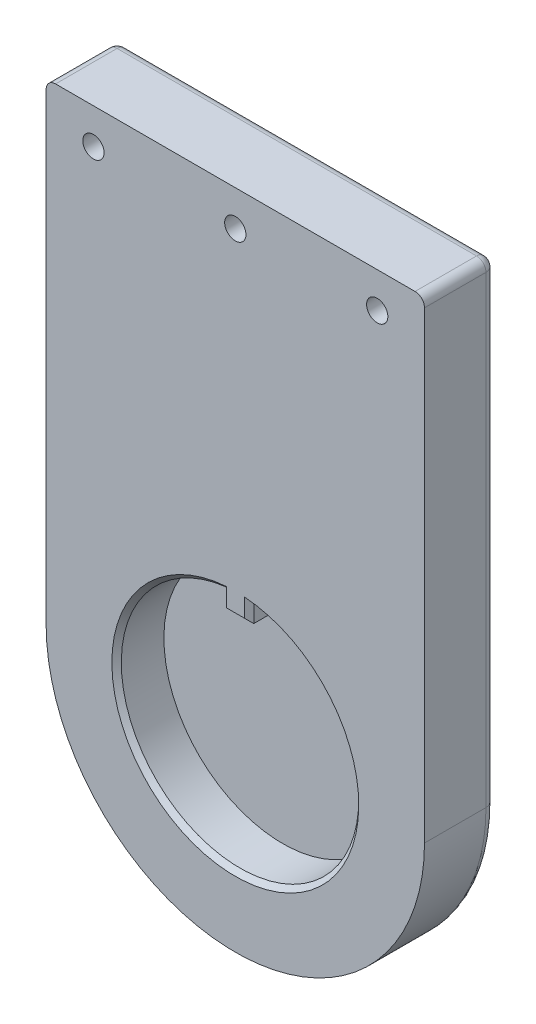
ISO-10303-21;
HEADER;
FILE_DESCRIPTION(('STEP AP214'),'2;1');
FILE_NAME('part.step','',(''),(''),'','','');
FILE_SCHEMA(('AUTOMOTIVE_DESIGN { 1 0 10303 214 1 1 1 1 }'));
ENDSEC;
DATA;
#1=APPLICATION_CONTEXT('core data for automotive mechanical design processes');
#2=APPLICATION_PROTOCOL_DEFINITION('international standard','automotive_design',2000,#1);
#3=PRODUCT_CONTEXT('',#1,'mechanical');
#4=PRODUCT('Part','Part','',(#3));
#5=PRODUCT_RELATED_PRODUCT_CATEGORY('part','',(#4));
#6=PRODUCT_DEFINITION_FORMATION('','',#4);
#7=PRODUCT_DEFINITION_CONTEXT('part definition',#1,'design');
#8=PRODUCT_DEFINITION('design','',#6,#7);
#9=PRODUCT_DEFINITION_SHAPE('','',#8);
#10=(LENGTH_UNIT() NAMED_UNIT(*) SI_UNIT(.MILLI.,.METRE.));
#11=(NAMED_UNIT(*) PLANE_ANGLE_UNIT() SI_UNIT($,.RADIAN.));
#12=(NAMED_UNIT(*) SI_UNIT($,.STERADIAN.) SOLID_ANGLE_UNIT());
#13=UNCERTAINTY_MEASURE_WITH_UNIT(LENGTH_MEASURE(1.E-05),#10,'distance_accuracy_value','');
#14=(GEOMETRIC_REPRESENTATION_CONTEXT(3) GLOBAL_UNCERTAINTY_ASSIGNED_CONTEXT((#13)) GLOBAL_UNIT_ASSIGNED_CONTEXT((#10,
#11,#12)) REPRESENTATION_CONTEXT('',''));
#15=CARTESIAN_POINT('',(0.,0.,0.));
#16=DIRECTION('',(0.,0.,1.));
#17=DIRECTION('',(1.,0.,0.));
#18=AXIS2_PLACEMENT_3D('',#15,#16,#17);
#19=CARTESIAN_POINT('',(0.,0.,15.));
#20=DIRECTION('',(0.,0.,-1.));
#21=DIRECTION('',(-1.,0.,0.));
#22=AXIS2_PLACEMENT_3D('',#19,#20,#21);
#23=CYLINDRICAL_SURFACE('',#22,40.);
#24=DIRECTION('',(0.,0.,-1.));
#25=VECTOR('',#24,1.);
#26=CARTESIAN_POINT('',(-40.,0.,15.));
#27=LINE('',#26,#25);
#28=CARTESIAN_POINT('',(-40.,0.,15.));
#29=VERTEX_POINT('',#28);
#30=CARTESIAN_POINT('',(-40.,0.,2.));
#31=VERTEX_POINT('',#30);
#32=EDGE_CURVE('E180',#29,#31,#27,.T.);
#33=ORIENTED_EDGE('',*,*,#32,.T.);
#34=CARTESIAN_POINT('',(0.,0.,2.));
#35=DIRECTION('',(0.,0.,1.));
#36=DIRECTION('',(1.,0.,0.));
#37=AXIS2_PLACEMENT_3D('',#34,#35,#36);
#38=CIRCLE('',#37,40.);
#39=CARTESIAN_POINT('',(40.,0.,2.));
#40=VERTEX_POINT('',#39);
#41=EDGE_CURVE('E282',#31,#40,#38,.T.);
#42=ORIENTED_EDGE('',*,*,#41,.T.);
#43=DIRECTION('',(0.,0.,-1.));
#44=VECTOR('',#43,1.);
#45=CARTESIAN_POINT('',(40.,0.,15.));
#46=LINE('',#45,#44);
#47=CARTESIAN_POINT('',(40.,0.,15.));
#48=VERTEX_POINT('',#47);
#49=EDGE_CURVE('E236',#48,#40,#46,.T.);
#50=ORIENTED_EDGE('',*,*,#49,.F.);
#51=CARTESIAN_POINT('',(0.,0.,15.));
#52=DIRECTION('',(0.,0.,1.));
#53=DIRECTION('',(1.,0.,0.));
#54=AXIS2_PLACEMENT_3D('',#51,#52,#53);
#55=CIRCLE('',#54,40.);
#56=EDGE_CURVE('E196',#29,#48,#55,.T.);
#57=ORIENTED_EDGE('',*,*,#56,.F.);
#58=EDGE_LOOP('',(#33,#42,#50,#57));
#59=FACE_BOUND('',#58,.T.);
#60=ADVANCED_FACE('F41',(#59),#23,.T.);
#61=CARTESIAN_POINT('',(0.,0.,15.));
#62=DIRECTION('',(0.,0.,1.));
#63=DIRECTION('',(1.,0.,0.));
#64=AXIS2_PLACEMENT_3D('',#61,#62,#63);
#65=PLANE('',#64);
#66=CARTESIAN_POINT('',(-30.,92.5,15.));
#67=DIRECTION('',(0.,0.,-1.));
#68=DIRECTION('',(1.,0.,0.));
#69=AXIS2_PLACEMENT_3D('',#66,#67,#68);
#70=CIRCLE('',#69,2.25);
#71=CARTESIAN_POINT('',(-27.75,92.5,15.));
#72=VERTEX_POINT('',#71);
#73=EDGE_CURVE('E336',#72,#72,#70,.T.);
#74=ORIENTED_EDGE('',*,*,#73,.T.);
#75=EDGE_LOOP('',(#74));
#76=FACE_BOUND('',#75,.T.);
#77=CARTESIAN_POINT('',(30.,92.5,15.));
#78=DIRECTION('',(0.,0.,-1.));
#79=DIRECTION('',(-1.,0.,0.));
#80=AXIS2_PLACEMENT_3D('',#77,#78,#79);
#81=CIRCLE('',#80,2.25);
#82=CARTESIAN_POINT('',(27.75,92.5,15.));
#83=VERTEX_POINT('',#82);
#84=EDGE_CURVE('E355',#83,#83,#81,.T.);
#85=ORIENTED_EDGE('',*,*,#84,.T.);
#86=EDGE_LOOP('',(#85));
#87=FACE_BOUND('',#86,.T.);
#88=CARTESIAN_POINT('',(0.,92.5,15.));
#89=DIRECTION('',(0.,0.,-1.));
#90=DIRECTION('',(-1.,0.,0.));
#91=AXIS2_PLACEMENT_3D('',#88,#89,#90);
#92=CIRCLE('',#91,2.25);
#93=CARTESIAN_POINT('',(-2.25000000000001,92.5,15.));
#94=VERTEX_POINT('',#93);
#95=EDGE_CURVE('E346',#94,#94,#92,.T.);
#96=ORIENTED_EDGE('',*,*,#95,.T.);
#97=EDGE_LOOP('',(#96));
#98=FACE_BOUND('',#97,.T.);
#99=DIRECTION('',(1.,0.,0.));
#100=VECTOR('',#99,1.);
#101=CARTESIAN_POINT('',(0.,22.1319072675959,15.));
#102=LINE('',#101,#100);
#103=CARTESIAN_POINT('',(-1.89999999999999,22.1319072675959,15.));
#104=VERTEX_POINT('',#103);
#105=CARTESIAN_POINT('',(1.89999999999999,22.1319072675959,15.));
#106=VERTEX_POINT('',#105);
#107=EDGE_CURVE('E206',#104,#106,#102,.T.);
#108=ORIENTED_EDGE('',*,*,#107,.T.);
#109=DIRECTION('',(0.,1.,0.));
#110=VECTOR('',#109,1.);
#111=CARTESIAN_POINT('',(1.89999999999999,0.,15.));
#112=LINE('',#111,#110);
#113=CARTESIAN_POINT('',(1.89999999999999,26.0307510456383,15.));
#114=VERTEX_POINT('',#113);
#115=EDGE_CURVE('E209',#106,#114,#112,.T.);
#116=ORIENTED_EDGE('',*,*,#115,.T.);
#117=CARTESIAN_POINT('',(0.,0.,15.));
#118=DIRECTION('',(0.,0.,1.));
#119=DIRECTION('',(1.,0.,0.));
#120=AXIS2_PLACEMENT_3D('',#117,#118,#119);
#121=CIRCLE('',#120,26.1);
#122=CARTESIAN_POINT('',(-1.89999999999999,26.0307510456383,15.));
#123=VERTEX_POINT('',#122);
#124=EDGE_CURVE('E200',#114,#123,#121,.F.);
#125=ORIENTED_EDGE('',*,*,#124,.T.);
#126=DIRECTION('',(0.,-1.,0.));
#127=VECTOR('',#126,1.);
#128=CARTESIAN_POINT('',(-1.89999999999999,0.,15.));
#129=LINE('',#128,#127);
#130=EDGE_CURVE('E203',#123,#104,#129,.T.);
#131=ORIENTED_EDGE('',*,*,#130,.T.);
#132=EDGE_LOOP('',(#108,#116,#125,#131));
#133=FACE_BOUND('',#132,.T.);
#134=DIRECTION('',(0.,-1.,0.));
#135=VECTOR('',#134,1.);
#136=CARTESIAN_POINT('',(40.,0.,15.));
#137=LINE('',#136,#135);
#138=CARTESIAN_POINT('',(40.,98.,15.));
#139=VERTEX_POINT('',#138);
#140=EDGE_CURVE('E362',#139,#48,#137,.T.);
#141=ORIENTED_EDGE('',*,*,#140,.F.);
#142=CARTESIAN_POINT('',(38.,98.,15.));
#143=DIRECTION('',(0.,0.,1.));
#144=DIRECTION('',(1.,0.,0.));
#145=AXIS2_PLACEMENT_3D('',#142,#143,#144);
#146=CIRCLE('',#145,2.);
#147=CARTESIAN_POINT('',(38.,100.,15.));
#148=VERTEX_POINT('',#147);
#149=EDGE_CURVE('E296',#139,#148,#146,.T.);
#150=ORIENTED_EDGE('',*,*,#149,.T.);
#151=DIRECTION('',(1.,0.,0.));
#152=VECTOR('',#151,1.);
#153=CARTESIAN_POINT('',(40.,100.,15.));
#154=LINE('',#153,#152);
#155=CARTESIAN_POINT('',(-38.,100.,15.));
#156=VERTEX_POINT('',#155);
#157=EDGE_CURVE('E358',#156,#148,#154,.T.);
#158=ORIENTED_EDGE('',*,*,#157,.F.);
#159=CARTESIAN_POINT('',(-38.,98.,15.));
#160=DIRECTION('',(0.,0.,1.));
#161=DIRECTION('',(1.,0.,0.));
#162=AXIS2_PLACEMENT_3D('',#159,#160,#161);
#163=CIRCLE('',#162,2.);
#164=CARTESIAN_POINT('',(-40.,98.,15.));
#165=VERTEX_POINT('',#164);
#166=EDGE_CURVE('E65',#156,#165,#163,.T.);
#167=ORIENTED_EDGE('',*,*,#166,.T.);
#168=DIRECTION('',(0.,1.,0.));
#169=VECTOR('',#168,1.);
#170=CARTESIAN_POINT('',(-40.,0.,15.));
#171=LINE('',#170,#169);
#172=EDGE_CURVE('E350',#29,#165,#171,.T.);
#173=ORIENTED_EDGE('',*,*,#172,.F.);
#174=ORIENTED_EDGE('',*,*,#56,.T.);
#175=EDGE_LOOP('',(#141,#150,#158,#167,#173,#174));
#176=FACE_BOUND('',#175,.T.);
#177=ADVANCED_FACE('F393',(#76,#87,#98,#133,#176),#65,.T.);
#178=CARTESIAN_POINT('',(0.,0.,0.));
#179=DIRECTION('',(0.,0.,1.));
#180=DIRECTION('',(1.,0.,0.));
#181=AXIS2_PLACEMENT_3D('',#178,#179,#180);
#182=PLANE('',#181);
#183=DIRECTION('',(1.,0.,0.));
#184=VECTOR('',#183,1.);
#185=CARTESIAN_POINT('',(40.,98.,0.));
#186=LINE('',#185,#184);
#187=CARTESIAN_POINT('',(-38.,98.,0.));
#188=VERTEX_POINT('',#187);
#189=CARTESIAN_POINT('',(38.,98.,0.));
#190=VERTEX_POINT('',#189);
#191=EDGE_CURVE('E225',#188,#190,#186,.T.);
#192=ORIENTED_EDGE('',*,*,#191,.T.);
#193=DIRECTION('',(0.,-1.,0.));
#194=VECTOR('',#193,1.);
#195=CARTESIAN_POINT('',(38.,0.,0.));
#196=LINE('',#195,#194);
#197=CARTESIAN_POINT('',(38.,0.,0.));
#198=VERTEX_POINT('',#197);
#199=EDGE_CURVE('E271',#190,#198,#196,.T.);
#200=ORIENTED_EDGE('',*,*,#199,.T.);
#201=CARTESIAN_POINT('',(0.,0.,0.));
#202=DIRECTION('',(0.,0.,1.));
#203=DIRECTION('',(1.,0.,0.));
#204=AXIS2_PLACEMENT_3D('',#201,#202,#203);
#205=CIRCLE('',#204,38.);
#206=CARTESIAN_POINT('',(-38.,0.,0.));
#207=VERTEX_POINT('',#206);
#208=EDGE_CURVE('E268',#198,#207,#205,.F.);
#209=ORIENTED_EDGE('',*,*,#208,.T.);
#210=DIRECTION('',(0.,1.,0.));
#211=VECTOR('',#210,1.);
#212=CARTESIAN_POINT('',(-38.,100.,0.));
#213=LINE('',#212,#211);
#214=EDGE_CURVE('E265',#207,#188,#213,.T.);
#215=ORIENTED_EDGE('',*,*,#214,.T.);
#216=EDGE_LOOP('',(#192,#200,#209,#215));
#217=FACE_BOUND('',#216,.T.);
#218=CARTESIAN_POINT('',(-30.,92.5,0.));
#219=DIRECTION('',(0.,0.,-1.));
#220=DIRECTION('',(1.,0.,0.));
#221=AXIS2_PLACEMENT_3D('',#218,#219,#220);
#222=CIRCLE('',#221,2.25);
#223=CARTESIAN_POINT('',(-27.75,92.5,0.));
#224=VERTEX_POINT('',#223);
#225=EDGE_CURVE('E331',#224,#224,#222,.T.);
#226=ORIENTED_EDGE('',*,*,#225,.F.);
#227=EDGE_LOOP('',(#226));
#228=FACE_BOUND('',#227,.T.);
#229=CARTESIAN_POINT('',(30.,92.5,0.));
#230=DIRECTION('',(0.,0.,-1.));
#231=DIRECTION('',(-1.,0.,0.));
#232=AXIS2_PLACEMENT_3D('',#229,#230,#231);
#233=CIRCLE('',#232,2.25);
#234=CARTESIAN_POINT('',(27.75,92.5,0.));
#235=VERTEX_POINT('',#234);
#236=EDGE_CURVE('E342',#235,#235,#233,.T.);
#237=ORIENTED_EDGE('',*,*,#236,.F.);
#238=EDGE_LOOP('',(#237));
#239=FACE_BOUND('',#238,.T.);
#240=CARTESIAN_POINT('',(0.,92.5,0.));
#241=DIRECTION('',(0.,0.,-1.));
#242=DIRECTION('',(-1.,0.,0.));
#243=AXIS2_PLACEMENT_3D('',#240,#241,#242);
#244=CIRCLE('',#243,2.25);
#245=CARTESIAN_POINT('',(-2.25000000000001,92.5,0.));
#246=VERTEX_POINT('',#245);
#247=EDGE_CURVE('E351',#246,#246,#244,.T.);
#248=ORIENTED_EDGE('',*,*,#247,.F.);
#249=EDGE_LOOP('',(#248));
#250=FACE_BOUND('',#249,.T.);
#251=ADVANCED_FACE('F417',(#217,#228,#239,#250),#182,.F.);
#252=CARTESIAN_POINT('',(0.,0.,5.));
#253=DIRECTION('',(0.,0.,1.));
#254=DIRECTION('',(1.,0.,0.));
#255=AXIS2_PLACEMENT_3D('',#252,#253,#254);
#256=CYLINDRICAL_SURFACE('',#255,25.1);
#257=DIRECTION('',(0.,0.,1.));
#258=VECTOR('',#257,1.);
#259=CARTESIAN_POINT('',(-2.9,24.9319072675959,5.));
#260=LINE('',#259,#258);
#261=CARTESIAN_POINT('',(-2.9,24.9319072675959,5.));
#262=VERTEX_POINT('',#261);
#263=CARTESIAN_POINT('',(-2.9,24.9319072675959,14.));
#264=VERTEX_POINT('',#263);
#265=EDGE_CURVE('E167',#262,#264,#260,.T.);
#266=ORIENTED_EDGE('',*,*,#265,.T.);
#267=CARTESIAN_POINT('',(0.,0.,14.));
#268=DIRECTION('',(0.,0.,1.));
#269=DIRECTION('',(1.,0.,0.));
#270=AXIS2_PLACEMENT_3D('',#267,#268,#269);
#271=CIRCLE('',#270,25.1);
#272=CARTESIAN_POINT('',(2.9,24.9319072675959,14.));
#273=VERTEX_POINT('',#272);
#274=EDGE_CURVE('E222',#264,#273,#271,.T.);
#275=ORIENTED_EDGE('',*,*,#274,.T.);
#276=DIRECTION('',(0.,0.,1.));
#277=VECTOR('',#276,1.);
#278=CARTESIAN_POINT('',(2.9,24.9319072675959,5.));
#279=LINE('',#278,#277);
#280=CARTESIAN_POINT('',(2.9,24.9319072675959,5.));
#281=VERTEX_POINT('',#280);
#282=EDGE_CURVE('E185',#281,#273,#279,.T.);
#283=ORIENTED_EDGE('',*,*,#282,.F.);
#284=CARTESIAN_POINT('',(0.,0.,5.));
#285=DIRECTION('',(0.,0.,1.));
#286=DIRECTION('',(1.,0.,0.));
#287=AXIS2_PLACEMENT_3D('',#284,#285,#286);
#288=CIRCLE('',#287,25.1);
#289=EDGE_CURVE('E189',#262,#281,#288,.T.);
#290=ORIENTED_EDGE('',*,*,#289,.F.);
#291=EDGE_LOOP('',(#266,#275,#283,#290));
#292=FACE_BOUND('',#291,.T.);
#293=ADVANCED_FACE('F422',(#292),#256,.F.);
#294=CARTESIAN_POINT('',(0.,0.,5.));
#295=DIRECTION('',(0.,0.,1.));
#296=DIRECTION('',(1.,0.,0.));
#297=AXIS2_PLACEMENT_3D('',#294,#295,#296);
#298=PLANE('',#297);
#299=DIRECTION('',(0.,1.,0.));
#300=VECTOR('',#299,1.);
#301=CARTESIAN_POINT('',(2.9,21.1319072675959,5.));
#302=LINE('',#301,#300);
#303=CARTESIAN_POINT('',(2.9,21.1319072675959,5.));
#304=VERTEX_POINT('',#303);
#305=EDGE_CURVE('E152',#304,#281,#302,.T.);
#306=ORIENTED_EDGE('',*,*,#305,.F.);
#307=DIRECTION('',(1.,0.,0.));
#308=VECTOR('',#307,1.);
#309=CARTESIAN_POINT('',(2.9,21.1319072675959,5.));
#310=LINE('',#309,#308);
#311=CARTESIAN_POINT('',(-2.9,21.1319072675959,5.));
#312=VERTEX_POINT('',#311);
#313=EDGE_CURVE('E144',#312,#304,#310,.T.);
#314=ORIENTED_EDGE('',*,*,#313,.F.);
#315=DIRECTION('',(0.,-1.,0.));
#316=VECTOR('',#315,1.);
#317=CARTESIAN_POINT('',(-2.9,21.1319072675959,5.));
#318=LINE('',#317,#316);
#319=EDGE_CURVE('E149',#262,#312,#318,.T.);
#320=ORIENTED_EDGE('',*,*,#319,.F.);
#321=ORIENTED_EDGE('',*,*,#289,.T.);
#322=EDGE_LOOP('',(#306,#314,#320,#321));
#323=FACE_BOUND('',#322,.T.);
#324=ADVANCED_FACE('F146',(#323),#298,.T.);
#325=CARTESIAN_POINT('',(2.9,21.1319072675959,5.));
#326=DIRECTION('',(1.,0.,0.));
#327=DIRECTION('',(0.,0.,-1.));
#328=AXIS2_PLACEMENT_3D('',#325,#326,#327);
#329=PLANE('',#328);
#330=ORIENTED_EDGE('',*,*,#282,.T.);
#331=DIRECTION('',(0.,-1.,0.));
#332=VECTOR('',#331,1.);
#333=CARTESIAN_POINT('',(2.9,21.1319072675959,14.));
#334=LINE('',#333,#332);
#335=CARTESIAN_POINT('',(2.9,21.1319072675959,14.));
#336=VERTEX_POINT('',#335);
#337=EDGE_CURVE('E213',#273,#336,#334,.T.);
#338=ORIENTED_EDGE('',*,*,#337,.T.);
#339=DIRECTION('',(0.,0.,1.));
#340=VECTOR('',#339,1.);
#341=CARTESIAN_POINT('',(2.9,21.1319072675959,5.));
#342=LINE('',#341,#340);
#343=EDGE_CURVE('E166',#304,#336,#342,.T.);
#344=ORIENTED_EDGE('',*,*,#343,.F.);
#345=ORIENTED_EDGE('',*,*,#305,.T.);
#346=EDGE_LOOP('',(#330,#338,#344,#345));
#347=FACE_BOUND('',#346,.T.);
#348=ADVANCED_FACE('F430',(#347),#329,.T.);
#349=CARTESIAN_POINT('',(2.9,21.1319072675959,5.));
#350=DIRECTION('',(0.,-1.,0.));
#351=DIRECTION('',(0.,0.,-1.));
#352=AXIS2_PLACEMENT_3D('',#349,#350,#351);
#353=PLANE('',#352);
#354=ORIENTED_EDGE('',*,*,#343,.T.);
#355=DIRECTION('',(-1.,0.,0.));
#356=VECTOR('',#355,1.);
#357=CARTESIAN_POINT('',(2.9,21.1319072675959,14.));
#358=LINE('',#357,#356);
#359=CARTESIAN_POINT('',(-2.9,21.1319072675959,14.));
#360=VERTEX_POINT('',#359);
#361=EDGE_CURVE('E162',#336,#360,#358,.T.);
#362=ORIENTED_EDGE('',*,*,#361,.T.);
#363=DIRECTION('',(0.,0.,1.));
#364=VECTOR('',#363,1.);
#365=CARTESIAN_POINT('',(-2.9,21.1319072675959,5.));
#366=LINE('',#365,#364);
#367=EDGE_CURVE('E159',#312,#360,#366,.T.);
#368=ORIENTED_EDGE('',*,*,#367,.F.);
#369=ORIENTED_EDGE('',*,*,#313,.T.);
#370=EDGE_LOOP('',(#354,#362,#368,#369));
#371=FACE_BOUND('',#370,.T.);
#372=ADVANCED_FACE('F160',(#371),#353,.T.);
#373=CARTESIAN_POINT('',(-2.9,21.1319072675959,5.));
#374=DIRECTION('',(-1.,0.,0.));
#375=DIRECTION('',(0.,0.,1.));
#376=AXIS2_PLACEMENT_3D('',#373,#374,#375);
#377=PLANE('',#376);
#378=ORIENTED_EDGE('',*,*,#367,.T.);
#379=DIRECTION('',(0.,1.,0.));
#380=VECTOR('',#379,1.);
#381=CARTESIAN_POINT('',(-2.9,21.1319072675959,14.));
#382=LINE('',#381,#380);
#383=EDGE_CURVE('E219',#360,#264,#382,.T.);
#384=ORIENTED_EDGE('',*,*,#383,.T.);
#385=ORIENTED_EDGE('',*,*,#265,.F.);
#386=ORIENTED_EDGE('',*,*,#319,.T.);
#387=EDGE_LOOP('',(#378,#384,#385,#386));
#388=FACE_BOUND('',#387,.T.);
#389=ADVANCED_FACE('F170',(#388),#377,.T.);
#390=CARTESIAN_POINT('',(-1.89999999999999,0.,15.));
#391=DIRECTION('',(0.707106781186549,0.,-0.707106781186546));
#392=DIRECTION('',(0.,-1.,0.));
#393=AXIS2_PLACEMENT_3D('',#390,#391,#392);
#394=PLANE('',#393);
#395=CARTESIAN_POINT('',(-2.9,24.9319072675959,14.));
#396=CARTESIAN_POINT('',(-2.81735418176432,25.0247232895777,14.0826458182357));
#397=CARTESIAN_POINT('',(-2.73452999779351,25.1172215233435,14.1654700022065));
#398=CARTESIAN_POINT('',(-2.56853650414143,25.3015899638733,14.3314634958586));
#399=CARTESIAN_POINT('',(-2.48536720393713,25.3934601877016,14.4146327960628));
#400=CARTESIAN_POINT('',(-2.31869068499806,25.5765850981255,14.5813093150019));
#401=CARTESIAN_POINT('',(-2.23518346671653,25.6678397855462,14.6648165332834));
#402=CARTESIAN_POINT('',(-2.06783756405745,25.8497459940062,14.8321624359425));
#403=CARTESIAN_POINT('',(-1.98399887069916,25.9403974985223,14.9160011293008));
#404=CARTESIAN_POINT('',(-1.89999999999999,26.0307510456383,15.));
#405=B_SPLINE_CURVE_WITH_KNOTS('',3,(#395,#396,#397,#398,#399,#400,#401,#402,#403,#404),
.UNSPECIFIED.,.F.,.F.,(4,2,2,2,4),(0.,0.447748453945546,0.895484692904589,1.34322033150376,
1.79096818498207),.UNSPECIFIED.);
#406=EDGE_CURVE('E177',#264,#123,#405,.T.);
#407=ORIENTED_EDGE('',*,*,#406,.F.);
#408=ORIENTED_EDGE('',*,*,#383,.F.);
#409=DIRECTION('',(0.577350269189625,0.577350269189625,0.577350269189627));
#410=VECTOR('',#409,1.);
#411=CARTESIAN_POINT('',(-9.27730242253193,14.7546048450639,7.62269757746803));
#412=LINE('',#411,#410);
#413=EDGE_CURVE('E173',#104,#360,#412,.F.);
#414=ORIENTED_EDGE('',*,*,#413,.F.);
#415=ORIENTED_EDGE('',*,*,#130,.F.);
#416=EDGE_LOOP('',(#407,#408,#414,#415));
#417=FACE_BOUND('',#416,.T.);
#418=ADVANCED_FACE('F252',(#417),#394,.F.);
#419=CARTESIAN_POINT('',(0.,22.1319072675959,15.));
#420=DIRECTION('',(0.,0.707106781186549,-0.707106781186546));
#421=DIRECTION('',(1.,0.,0.));
#422=AXIS2_PLACEMENT_3D('',#419,#420,#421);
#423=PLANE('',#422);
#424=ORIENTED_EDGE('',*,*,#413,.T.);
#425=ORIENTED_EDGE('',*,*,#361,.F.);
#426=DIRECTION('',(-0.577350269189625,0.577350269189625,0.577350269189627));
#427=VECTOR('',#426,1.);
#428=CARTESIAN_POINT('',(1.26666666666666,22.7652406009292,15.6333333333333));
#429=LINE('',#428,#427);
#430=EDGE_CURVE('E235',#106,#336,#429,.F.);
#431=ORIENTED_EDGE('',*,*,#430,.F.);
#432=ORIENTED_EDGE('',*,*,#107,.F.);
#433=EDGE_LOOP('',(#424,#425,#431,#432));
#434=FACE_BOUND('',#433,.T.);
#435=ADVANCED_FACE('F250',(#434),#423,.F.);
#436=CARTESIAN_POINT('',(0.,0.,14.));
#437=DIRECTION('',(0.,0.,1.));
#438=DIRECTION('',(1.,0.,0.));
#439=AXIS2_PLACEMENT_3D('',#436,#437,#438);
#440=CONICAL_SURFACE('',#439,25.1,0.785398163397447);
#441=ORIENTED_EDGE('',*,*,#406,.T.);
#442=ORIENTED_EDGE('',*,*,#124,.F.);
#443=CARTESIAN_POINT('',(1.89999999999999,26.0307510456383,15.));
#444=CARTESIAN_POINT('',(1.98399887069916,25.9403974985223,14.9160011293008));
#445=CARTESIAN_POINT('',(2.06783756405745,25.8497459940062,14.8321624359425));
#446=CARTESIAN_POINT('',(2.23518346671653,25.6678397855462,14.6648165332834));
#447=CARTESIAN_POINT('',(2.31869068499806,25.5765850981255,14.5813093150019));
#448=CARTESIAN_POINT('',(2.48536720393713,25.3934601877016,14.4146327960628));
#449=CARTESIAN_POINT('',(2.56853650414143,25.3015899638733,14.3314634958586));
#450=CARTESIAN_POINT('',(2.73452999779351,25.1172215233435,14.1654700022065));
#451=CARTESIAN_POINT('',(2.81735418176432,25.0247232895777,14.0826458182357));
#452=CARTESIAN_POINT('',(2.9,24.9319072675959,14.));
#453=B_SPLINE_CURVE_WITH_KNOTS('',3,(#443,#444,#445,#446,#447,#448,#449,#450,#451,#452),
.UNSPECIFIED.,.F.,.F.,(4,2,2,2,4),(0.,0.447747853478302,0.895483492077475,1.34321973103652,
1.79096818498206),.UNSPECIFIED.);
#454=EDGE_CURVE('E226',#273,#114,#453,.F.);
#455=ORIENTED_EDGE('',*,*,#454,.F.);
#456=ORIENTED_EDGE('',*,*,#274,.F.);
#457=EDGE_LOOP('',(#441,#442,#455,#456));
#458=FACE_BOUND('',#457,.T.);
#459=ADVANCED_FACE('F243',(#458),#440,.F.);
#460=CARTESIAN_POINT('',(1.89999999999999,0.,15.));
#461=DIRECTION('',(-0.707106781186549,0.,-0.707106781186546));
#462=DIRECTION('',(0.,1.,0.));
#463=AXIS2_PLACEMENT_3D('',#460,#461,#462);
#464=PLANE('',#463);
#465=ORIENTED_EDGE('',*,*,#430,.T.);
#466=ORIENTED_EDGE('',*,*,#337,.F.);
#467=ORIENTED_EDGE('',*,*,#454,.T.);
#468=ORIENTED_EDGE('',*,*,#115,.F.);
#469=EDGE_LOOP('',(#465,#466,#467,#468));
#470=FACE_BOUND('',#469,.T.);
#471=ADVANCED_FACE('F239',(#470),#464,.F.);
#472=CARTESIAN_POINT('',(40.,0.,15.));
#473=DIRECTION('',(1.,0.,0.));
#474=DIRECTION('',(0.,0.,-1.));
#475=AXIS2_PLACEMENT_3D('',#472,#473,#474);
#476=PLANE('',#475);
#477=ORIENTED_EDGE('',*,*,#49,.T.);
#478=DIRECTION('',(0.,-1.,0.));
#479=VECTOR('',#478,1.);
#480=CARTESIAN_POINT('',(40.,100.,2.));
#481=LINE('',#480,#479);
#482=CARTESIAN_POINT('',(40.,98.,2.));
#483=VERTEX_POINT('',#482);
#484=EDGE_CURVE('E278',#40,#483,#481,.F.);
#485=ORIENTED_EDGE('',*,*,#484,.T.);
#486=DIRECTION('',(0.,0.,-1.));
#487=VECTOR('',#486,1.);
#488=CARTESIAN_POINT('',(40.,98.,15.));
#489=LINE('',#488,#487);
#490=EDGE_CURVE('E275',#483,#139,#489,.F.);
#491=ORIENTED_EDGE('',*,*,#490,.T.);
#492=ORIENTED_EDGE('',*,*,#140,.T.);
#493=EDGE_LOOP('',(#477,#485,#491,#492));
#494=FACE_BOUND('',#493,.T.);
#495=ADVANCED_FACE('F387',(#494),#476,.T.);
#496=CARTESIAN_POINT('',(40.,100.,15.));
#497=DIRECTION('',(0.,1.,0.));
#498=DIRECTION('',(0.,0.,1.));
#499=AXIS2_PLACEMENT_3D('',#496,#497,#498);
#500=PLANE('',#499);
#501=ORIENTED_EDGE('',*,*,#157,.T.);
#502=DIRECTION('',(0.,0.,-1.));
#503=VECTOR('',#502,1.);
#504=CARTESIAN_POINT('',(38.,100.,15.));
#505=LINE('',#504,#503);
#506=CARTESIAN_POINT('',(38.,100.,2.));
#507=VERTEX_POINT('',#506);
#508=EDGE_CURVE('E291',#148,#507,#505,.T.);
#509=ORIENTED_EDGE('',*,*,#508,.T.);
#510=DIRECTION('',(1.,0.,0.));
#511=VECTOR('',#510,1.);
#512=CARTESIAN_POINT('',(-40.,100.,2.));
#513=LINE('',#512,#511);
#514=CARTESIAN_POINT('',(-38.,100.,2.));
#515=VERTEX_POINT('',#514);
#516=EDGE_CURVE('E285',#507,#515,#513,.F.);
#517=ORIENTED_EDGE('',*,*,#516,.T.);
#518=DIRECTION('',(0.,0.,-1.));
#519=VECTOR('',#518,1.);
#520=CARTESIAN_POINT('',(-38.,100.,15.));
#521=LINE('',#520,#519);
#522=EDGE_CURVE('E288',#515,#156,#521,.F.);
#523=ORIENTED_EDGE('',*,*,#522,.T.);
#524=EDGE_LOOP('',(#501,#509,#517,#523));
#525=FACE_BOUND('',#524,.T.);
#526=ADVANCED_FACE('F397',(#525),#500,.T.);
#527=CARTESIAN_POINT('',(-40.,0.,15.));
#528=DIRECTION('',(-1.,0.,0.));
#529=DIRECTION('',(0.,0.,1.));
#530=AXIS2_PLACEMENT_3D('',#527,#528,#529);
#531=PLANE('',#530);
#532=ORIENTED_EDGE('',*,*,#172,.T.);
#533=DIRECTION('',(0.,0.,-1.));
#534=VECTOR('',#533,1.);
#535=CARTESIAN_POINT('',(-40.,98.,15.));
#536=LINE('',#535,#534);
#537=CARTESIAN_POINT('',(-40.,98.,2.));
#538=VERTEX_POINT('',#537);
#539=EDGE_CURVE('E11',#165,#538,#536,.T.);
#540=ORIENTED_EDGE('',*,*,#539,.T.);
#541=DIRECTION('',(0.,1.,0.));
#542=VECTOR('',#541,1.);
#543=CARTESIAN_POINT('',(-40.,0.,2.));
#544=LINE('',#543,#542);
#545=EDGE_CURVE('E51',#538,#31,#544,.F.);
#546=ORIENTED_EDGE('',*,*,#545,.T.);
#547=ORIENTED_EDGE('',*,*,#32,.F.);
#548=EDGE_LOOP('',(#532,#540,#546,#547));
#549=FACE_BOUND('',#548,.T.);
#550=ADVANCED_FACE('F438',(#549),#531,.T.);
#551=CARTESIAN_POINT('',(0.,92.5,15.));
#552=DIRECTION('',(0.,0.,-1.));
#553=DIRECTION('',(-1.,0.,0.));
#554=AXIS2_PLACEMENT_3D('',#551,#552,#553);
#555=CYLINDRICAL_SURFACE('',#554,2.25);
#556=ORIENTED_EDGE('',*,*,#95,.F.);
#557=EDGE_LOOP('',(#556));
#558=FACE_BOUND('',#557,.T.);
#559=ORIENTED_EDGE('',*,*,#247,.T.);
#560=EDGE_LOOP('',(#559));
#561=FACE_BOUND('',#560,.T.);
#562=ADVANCED_FACE('F441',(#558,#561),#555,.F.);
#563=CARTESIAN_POINT('',(30.,92.5,15.));
#564=DIRECTION('',(0.,0.,-1.));
#565=DIRECTION('',(-1.,0.,0.));
#566=AXIS2_PLACEMENT_3D('',#563,#564,#565);
#567=CYLINDRICAL_SURFACE('',#566,2.25);
#568=ORIENTED_EDGE('',*,*,#84,.F.);
#569=EDGE_LOOP('',(#568));
#570=FACE_BOUND('',#569,.T.);
#571=ORIENTED_EDGE('',*,*,#236,.T.);
#572=EDGE_LOOP('',(#571));
#573=FACE_BOUND('',#572,.T.);
#574=ADVANCED_FACE('F448',(#570,#573),#567,.F.);
#575=CARTESIAN_POINT('',(-30.,92.5,15.));
#576=DIRECTION('',(0.,0.,-1.));
#577=DIRECTION('',(-1.,0.,0.));
#578=AXIS2_PLACEMENT_3D('',#575,#576,#577);
#579=CYLINDRICAL_SURFACE('',#578,2.25);
#580=ORIENTED_EDGE('',*,*,#73,.F.);
#581=EDGE_LOOP('',(#580));
#582=FACE_BOUND('',#581,.T.);
#583=ORIENTED_EDGE('',*,*,#225,.T.);
#584=EDGE_LOOP('',(#583));
#585=FACE_BOUND('',#584,.T.);
#586=ADVANCED_FACE('F450',(#582,#585),#579,.F.);
#587=CARTESIAN_POINT('',(-38.,98.,15.));
#588=DIRECTION('',(0.,0.,-1.));
#589=DIRECTION('',(-1.,0.,0.));
#590=AXIS2_PLACEMENT_3D('',#587,#588,#589);
#591=CYLINDRICAL_SURFACE('',#590,2.);
#592=CARTESIAN_POINT('',(-38.,98.,2.));
#593=DIRECTION('',(0.,0.,-1.));
#594=DIRECTION('',(-1.,0.,0.));
#595=AXIS2_PLACEMENT_3D('',#592,#593,#594);
#596=CIRCLE('',#595,2.);
#597=EDGE_CURVE('E45',#538,#515,#596,.T.);
#598=ORIENTED_EDGE('',*,*,#597,.F.);
#599=ORIENTED_EDGE('',*,*,#539,.F.);
#600=ORIENTED_EDGE('',*,*,#166,.F.);
#601=ORIENTED_EDGE('',*,*,#522,.F.);
#602=EDGE_LOOP('',(#598,#599,#600,#601));
#603=FACE_BOUND('',#602,.T.);
#604=ADVANCED_FACE('F43',(#603),#591,.T.);
#605=CARTESIAN_POINT('',(-38.,98.,2.));
#606=DIRECTION('',(0.,0.,1.));
#607=DIRECTION('',(1.,0.,0.));
#608=AXIS2_PLACEMENT_3D('',#605,#606,#607);
#609=SPHERICAL_SURFACE('',#608,2.);
#610=CARTESIAN_POINT('',(-38.,98.,2.));
#611=DIRECTION('',(0.,1.,0.));
#612=DIRECTION('',(0.,0.,1.));
#613=AXIS2_PLACEMENT_3D('',#610,#611,#612);
#614=CIRCLE('',#613,2.);
#615=EDGE_CURVE('E319',#538,#188,#614,.F.);
#616=ORIENTED_EDGE('',*,*,#615,.F.);
#617=ORIENTED_EDGE('',*,*,#597,.T.);
#618=CARTESIAN_POINT('',(-38.,98.,2.));
#619=DIRECTION('',(-1.,0.,0.));
#620=DIRECTION('',(0.,0.,1.));
#621=AXIS2_PLACEMENT_3D('',#618,#619,#620);
#622=CIRCLE('',#621,2.);
#623=EDGE_CURVE('E322',#188,#515,#622,.F.);
#624=ORIENTED_EDGE('',*,*,#623,.F.);
#625=EDGE_LOOP('',(#616,#617,#624));
#626=FACE_BOUND('',#625,.T.);
#627=ADVANCED_FACE('F530',(#626),#609,.T.);
#628=CARTESIAN_POINT('',(38.,98.,15.));
#629=DIRECTION('',(0.,0.,-1.));
#630=DIRECTION('',(-1.,0.,0.));
#631=AXIS2_PLACEMENT_3D('',#628,#629,#630);
#632=CYLINDRICAL_SURFACE('',#631,2.);
#633=ORIENTED_EDGE('',*,*,#149,.F.);
#634=ORIENTED_EDGE('',*,*,#490,.F.);
#635=CARTESIAN_POINT('',(38.,98.,2.));
#636=DIRECTION('',(0.,0.,-1.));
#637=DIRECTION('',(-1.,0.,0.));
#638=AXIS2_PLACEMENT_3D('',#635,#636,#637);
#639=CIRCLE('',#638,2.);
#640=EDGE_CURVE('E315',#507,#483,#639,.T.);
#641=ORIENTED_EDGE('',*,*,#640,.F.);
#642=ORIENTED_EDGE('',*,*,#508,.F.);
#643=EDGE_LOOP('',(#633,#634,#641,#642));
#644=FACE_BOUND('',#643,.T.);
#645=ADVANCED_FACE('F395',(#644),#632,.T.);
#646=CARTESIAN_POINT('',(0.,98.,2.));
#647=DIRECTION('',(-1.,0.,0.));
#648=DIRECTION('',(0.,0.,1.));
#649=AXIS2_PLACEMENT_3D('',#646,#647,#648);
#650=CYLINDRICAL_SURFACE('',#649,2.);
#651=ORIENTED_EDGE('',*,*,#623,.T.);
#652=ORIENTED_EDGE('',*,*,#516,.F.);
#653=CARTESIAN_POINT('',(38.,98.,2.));
#654=DIRECTION('',(1.,0.,0.));
#655=DIRECTION('',(0.,0.,-1.));
#656=AXIS2_PLACEMENT_3D('',#653,#654,#655);
#657=CIRCLE('',#656,2.);
#658=EDGE_CURVE('E311',#190,#507,#657,.T.);
#659=ORIENTED_EDGE('',*,*,#658,.F.);
#660=ORIENTED_EDGE('',*,*,#191,.F.);
#661=EDGE_LOOP('',(#651,#652,#659,#660));
#662=FACE_BOUND('',#661,.T.);
#663=ADVANCED_FACE('F400',(#662),#650,.T.);
#664=CARTESIAN_POINT('',(-38.,0.,2.));
#665=DIRECTION('',(0.,-1.,0.));
#666=DIRECTION('',(0.,0.,-1.));
#667=AXIS2_PLACEMENT_3D('',#664,#665,#666);
#668=CYLINDRICAL_SURFACE('',#667,2.);
#669=ORIENTED_EDGE('',*,*,#615,.T.);
#670=ORIENTED_EDGE('',*,*,#214,.F.);
#671=CARTESIAN_POINT('',(-38.,0.,2.));
#672=DIRECTION('',(0.,-1.,0.));
#673=DIRECTION('',(0.,0.,-1.));
#674=AXIS2_PLACEMENT_3D('',#671,#672,#673);
#675=CIRCLE('',#674,2.);
#676=EDGE_CURVE('E307',#31,#207,#675,.T.);
#677=ORIENTED_EDGE('',*,*,#676,.F.);
#678=ORIENTED_EDGE('',*,*,#545,.F.);
#679=EDGE_LOOP('',(#669,#670,#677,#678));
#680=FACE_BOUND('',#679,.T.);
#681=ADVANCED_FACE('F378',(#680),#668,.T.);
#682=CARTESIAN_POINT('',(38.,98.,2.));
#683=DIRECTION('',(0.,0.,1.));
#684=DIRECTION('',(1.,0.,0.));
#685=AXIS2_PLACEMENT_3D('',#682,#683,#684);
#686=SPHERICAL_SURFACE('',#685,2.);
#687=ORIENTED_EDGE('',*,*,#658,.T.);
#688=ORIENTED_EDGE('',*,*,#640,.T.);
#689=CARTESIAN_POINT('',(38.,98.,2.));
#690=DIRECTION('',(0.,1.,0.));
#691=DIRECTION('',(0.,0.,1.));
#692=AXIS2_PLACEMENT_3D('',#689,#690,#691);
#693=CIRCLE('',#692,2.);
#694=EDGE_CURVE('E304',#190,#483,#693,.F.);
#695=ORIENTED_EDGE('',*,*,#694,.F.);
#696=EDGE_LOOP('',(#687,#688,#695));
#697=FACE_BOUND('',#696,.T.);
#698=ADVANCED_FACE('F402',(#697),#686,.T.);
#699=CARTESIAN_POINT('',(0.,0.,2.));
#700=DIRECTION('',(0.,0.,1.));
#701=DIRECTION('',(1.,0.,0.));
#702=AXIS2_PLACEMENT_3D('',#699,#700,#701);
#703=TOROIDAL_SURFACE('',#702,38.,2.);
#704=ORIENTED_EDGE('',*,*,#676,.T.);
#705=ORIENTED_EDGE('',*,*,#208,.F.);
#706=CARTESIAN_POINT('',(38.,0.,2.));
#707=DIRECTION('',(0.,1.,0.));
#708=DIRECTION('',(0.,0.,1.));
#709=AXIS2_PLACEMENT_3D('',#706,#707,#708);
#710=CIRCLE('',#709,2.);
#711=EDGE_CURVE('E301',#40,#198,#710,.T.);
#712=ORIENTED_EDGE('',*,*,#711,.F.);
#713=ORIENTED_EDGE('',*,*,#41,.F.);
#714=EDGE_LOOP('',(#704,#705,#712,#713));
#715=FACE_BOUND('',#714,.T.);
#716=ADVANCED_FACE('F382',(#715),#703,.T.);
#717=CARTESIAN_POINT('',(38.,0.,2.));
#718=DIRECTION('',(0.,1.,0.));
#719=DIRECTION('',(0.,0.,1.));
#720=AXIS2_PLACEMENT_3D('',#717,#718,#719);
#721=CYLINDRICAL_SURFACE('',#720,2.);
#722=ORIENTED_EDGE('',*,*,#694,.T.);
#723=ORIENTED_EDGE('',*,*,#484,.F.);
#724=ORIENTED_EDGE('',*,*,#711,.T.);
#725=ORIENTED_EDGE('',*,*,#199,.F.);
#726=EDGE_LOOP('',(#722,#723,#724,#725));
#727=FACE_BOUND('',#726,.T.);
#728=ADVANCED_FACE('F385',(#727),#721,.T.);
#729=CLOSED_SHELL('',(#60,#177,#251,#293,#324,#348,#372,#389,#418,#435,#459,#471,#495,#526,#550,
#562,#574,#586,#604,#627,#645,#663,#681,#698,#716,#728));
#730=MANIFOLD_SOLID_BREP('B2',#729);
#731=ADVANCED_BREP_SHAPE_REPRESENTATION('',(#18,#730),#14);
#732=SHAPE_DEFINITION_REPRESENTATION(#9,#731);
ENDSEC;
END-ISO-10303-21;
